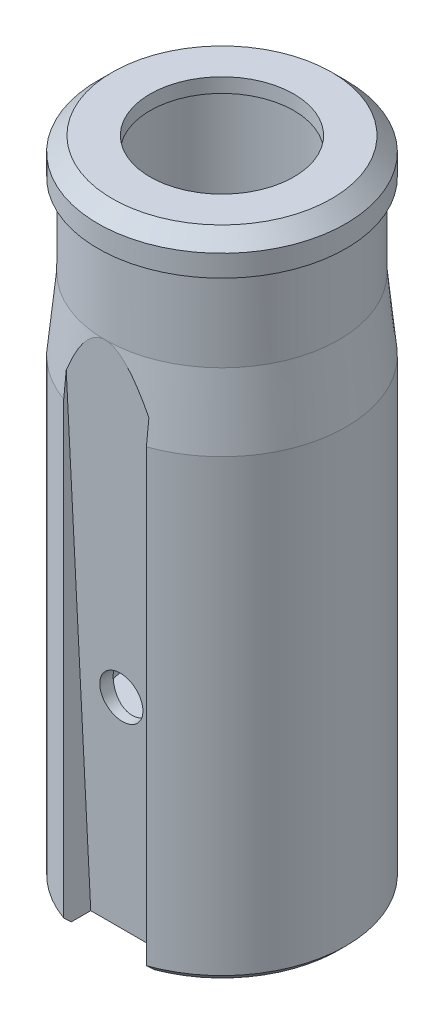
ISO-10303-21;
HEADER;
FILE_DESCRIPTION(('STEP AP214'),'2;1');
FILE_NAME('part.step','',(''),(''),'','','');
FILE_SCHEMA(('AUTOMOTIVE_DESIGN { 1 0 10303 214 1 1 1 1 }'));
ENDSEC;
DATA;
#1=APPLICATION_CONTEXT('core data for automotive mechanical design processes');
#2=APPLICATION_PROTOCOL_DEFINITION('international standard','automotive_design',2000,#1);
#3=PRODUCT_CONTEXT('',#1,'mechanical');
#4=PRODUCT('Part','Part','',(#3));
#5=PRODUCT_RELATED_PRODUCT_CATEGORY('part','',(#4));
#6=PRODUCT_DEFINITION_FORMATION('','',#4);
#7=PRODUCT_DEFINITION_CONTEXT('part definition',#1,'design');
#8=PRODUCT_DEFINITION('design','',#6,#7);
#9=PRODUCT_DEFINITION_SHAPE('','',#8);
#10=(LENGTH_UNIT() NAMED_UNIT(*) SI_UNIT(.MILLI.,.METRE.));
#11=(NAMED_UNIT(*) PLANE_ANGLE_UNIT() SI_UNIT($,.RADIAN.));
#12=(NAMED_UNIT(*) SI_UNIT($,.STERADIAN.) SOLID_ANGLE_UNIT());
#13=UNCERTAINTY_MEASURE_WITH_UNIT(LENGTH_MEASURE(1.E-05),#10,'distance_accuracy_value','');
#14=(GEOMETRIC_REPRESENTATION_CONTEXT(3) GLOBAL_UNCERTAINTY_ASSIGNED_CONTEXT((#13)) GLOBAL_UNIT_ASSIGNED_CONTEXT((#10,
#11,#12)) REPRESENTATION_CONTEXT('',''));
#15=CARTESIAN_POINT('',(0.,0.,0.));
#16=DIRECTION('',(0.,0.,1.));
#17=DIRECTION('',(1.,0.,0.));
#18=AXIS2_PLACEMENT_3D('',#15,#16,#17);
#19=CARTESIAN_POINT('',(1.1,0.,0.));
#20=DIRECTION('',(0.,-1.,0.));
#21=DIRECTION('',(0.,0.,-1.));
#22=AXIS2_PLACEMENT_3D('',#19,#20,#21);
#23=PLANE('',#22);
#24=CARTESIAN_POINT('',(0.,0.,0.));
#25=DIRECTION('',(0.,-1.,0.));
#26=DIRECTION('',(0.,0.,-1.));
#27=AXIS2_PLACEMENT_3D('',#24,#25,#26);
#28=CIRCLE('',#27,1.1);
#29=CARTESIAN_POINT('',(0.,0.,-1.1));
#30=VERTEX_POINT('',#29);
#31=EDGE_CURVE('E303',#30,#30,#28,.T.);
#32=ORIENTED_EDGE('',*,*,#31,.F.);
#33=EDGE_LOOP('',(#32));
#34=FACE_BOUND('',#33,.T.);
#35=CARTESIAN_POINT('',(0.,0.,0.));
#36=DIRECTION('',(0.,-1.,0.));
#37=DIRECTION('',(0.,0.,-1.));
#38=AXIS2_PLACEMENT_3D('',#35,#36,#37);
#39=CIRCLE('',#38,3.25);
#40=CARTESIAN_POINT('',(1.15,0.,-3.03973683071414));
#41=VERTEX_POINT('',#40);
#42=CARTESIAN_POINT('',(1.15,0.,3.03973683071414));
#43=VERTEX_POINT('',#42);
#44=EDGE_CURVE('E154',#41,#43,#39,.T.);
#45=ORIENTED_EDGE('',*,*,#44,.T.);
#46=DIRECTION('',(0.,0.,-1.));
#47=VECTOR('',#46,1.);
#48=CARTESIAN_POINT('',(1.15,0.,3.45));
#49=LINE('',#48,#47);
#50=CARTESIAN_POINT('',(1.15,0.,2.5));
#51=VERTEX_POINT('',#50);
#52=EDGE_CURVE('E138',#43,#51,#49,.T.);
#53=ORIENTED_EDGE('',*,*,#52,.T.);
#54=DIRECTION('',(-1.,0.,0.));
#55=VECTOR('',#54,1.);
#56=CARTESIAN_POINT('',(1.15,0.,2.5));
#57=LINE('',#56,#55);
#58=CARTESIAN_POINT('',(-1.15,0.,2.5));
#59=VERTEX_POINT('',#58);
#60=EDGE_CURVE('E145',#51,#59,#57,.T.);
#61=ORIENTED_EDGE('',*,*,#60,.T.);
#62=DIRECTION('',(0.,0.,1.));
#63=VECTOR('',#62,1.);
#64=CARTESIAN_POINT('',(-1.15,0.,3.45));
#65=LINE('',#64,#63);
#66=CARTESIAN_POINT('',(-1.15,0.,3.03973683071414));
#67=VERTEX_POINT('',#66);
#68=EDGE_CURVE('E149',#59,#67,#65,.T.);
#69=ORIENTED_EDGE('',*,*,#68,.T.);
#70=CARTESIAN_POINT('',(-1.15,0.,-3.03973683071414));
#71=VERTEX_POINT('',#70);
#72=EDGE_CURVE('E164',#67,#71,#39,.T.);
#73=ORIENTED_EDGE('',*,*,#72,.T.);
#74=DIRECTION('',(0.,0.,-1.));
#75=VECTOR('',#74,1.);
#76=CARTESIAN_POINT('',(-1.15,0.,-3.45));
#77=LINE('',#76,#75);
#78=CARTESIAN_POINT('',(-1.15,0.,-2.5));
#79=VERTEX_POINT('',#78);
#80=EDGE_CURVE('E178',#79,#71,#77,.T.);
#81=ORIENTED_EDGE('',*,*,#80,.F.);
#82=DIRECTION('',(-1.,0.,0.));
#83=VECTOR('',#82,1.);
#84=CARTESIAN_POINT('',(1.15,0.,-2.5));
#85=LINE('',#84,#83);
#86=CARTESIAN_POINT('',(1.15,0.,-2.5));
#87=VERTEX_POINT('',#86);
#88=EDGE_CURVE('E182',#87,#79,#85,.T.);
#89=ORIENTED_EDGE('',*,*,#88,.F.);
#90=DIRECTION('',(0.,0.,1.));
#91=VECTOR('',#90,1.);
#92=CARTESIAN_POINT('',(1.15,0.,-3.45));
#93=LINE('',#92,#91);
#94=EDGE_CURVE('E188',#41,#87,#93,.T.);
#95=ORIENTED_EDGE('',*,*,#94,.F.);
#96=EDGE_LOOP('',(#45,#53,#61,#69,#73,#81,#89,#95));
#97=FACE_BOUND('',#96,.T.);
#98=ADVANCED_FACE('F49',(#34,#97),#23,.T.);
#99=CARTESIAN_POINT('',(0.,0.,0.));
#100=DIRECTION('',(0.,1.,0.));
#101=DIRECTION('',(0.,0.,1.));
#102=AXIS2_PLACEMENT_3D('',#99,#100,#101);
#103=CONICAL_SURFACE('',#102,3.25,0.785398163397447);
#104=CARTESIAN_POINT('',(0.,0.2,0.));
#105=DIRECTION('',(0.,-1.,0.));
#106=DIRECTION('',(0.,0.,-1.));
#107=AXIS2_PLACEMENT_3D('',#104,#105,#106);
#108=CIRCLE('',#107,3.45);
#109=CARTESIAN_POINT('',(1.15,0.2,-3.25269119345812));
#110=VERTEX_POINT('',#109);
#111=CARTESIAN_POINT('',(1.15,0.2,3.25269119345812));
#112=VERTEX_POINT('',#111);
#113=EDGE_CURVE('E166',#110,#112,#108,.T.);
#114=ORIENTED_EDGE('',*,*,#113,.T.);
#115=CARTESIAN_POINT('',(1.15,0.200225,3.25292984102409));
#116=CARTESIAN_POINT('',(1.15,0.166733085444312,3.21741097282165));
#117=CARTESIAN_POINT('',(1.15,0.133276711997652,3.18185872559596));
#118=CARTESIAN_POINT('',(1.15,0.0664350453267408,3.11068747097317));
#119=CARTESIAN_POINT('',(1.15,0.0330497521067336,3.07506846357209));
#120=CARTESIAN_POINT('',(1.15,-0.000300000000000371,3.03941607714377));
#121=B_SPLINE_CURVE_WITH_KNOTS('',3,(#115,#116,#117,#118,#119,#120),.UNSPECIFIED.,.F.,.F.,(4,2,
4),(0.,0.146456890800636,0.292913790346612),.UNSPECIFIED.);
#122=EDGE_CURVE('E364',#112,#43,#121,.T.);
#123=ORIENTED_EDGE('',*,*,#122,.T.);
#124=ORIENTED_EDGE('',*,*,#44,.F.);
#125=CARTESIAN_POINT('',(1.15,-0.000199999999999813,-3.03952299547149));
#126=CARTESIAN_POINT('',(1.15,0.0331290101696303,-3.0751530570593));
#127=CARTESIAN_POINT('',(1.15,0.0664935157531291,-3.11074978248644));
#128=CARTESIAN_POINT('',(1.15,0.13329351575736,-3.18187655889995));
#129=CARTESIAN_POINT('',(1.15,0.166729010173861,-3.21740660989029));
#130=CARTESIAN_POINT('',(1.15,0.2002,-3.25290332472393));
#131=B_SPLINE_CURVE_WITH_KNOTS('',3,(#125,#126,#127,#128,#129,#130),.UNSPECIFIED.,.F.,.F.,(4,2,
4),(0.,0.146365480376002,0.292730952029218),.UNSPECIFIED.);
#132=EDGE_CURVE('E305',#41,#110,#131,.T.);
#133=ORIENTED_EDGE('',*,*,#132,.T.);
#134=EDGE_LOOP('',(#114,#123,#124,#133));
#135=FACE_BOUND('',#134,.T.);
#136=ADVANCED_FACE('F249',(#135),#103,.T.);
#137=ORIENTED_EDGE('',*,*,#72,.F.);
#138=CARTESIAN_POINT('',(-1.15,-0.000300000000000207,3.03941607714377));
#139=CARTESIAN_POINT('',(-1.15,0.0330497521067339,3.07506846357209));
#140=CARTESIAN_POINT('',(-1.15,0.066435045326741,3.11068747097317));
#141=CARTESIAN_POINT('',(-1.15,0.133276711997652,3.18185872559596));
#142=CARTESIAN_POINT('',(-1.15,0.166733085444312,3.21741097282165));
#143=CARTESIAN_POINT('',(-1.15,0.200225,3.25292984102409));
#144=B_SPLINE_CURVE_WITH_KNOTS('',3,(#138,#139,#140,#141,#142,#143),.UNSPECIFIED.,.F.,.F.,(4,2,
4),(0.,0.146456899545976,0.292913790346612),.UNSPECIFIED.);
#145=CARTESIAN_POINT('',(-1.15,0.2,3.25269119345812));
#146=VERTEX_POINT('',#145);
#147=EDGE_CURVE('E274',#67,#146,#144,.T.);
#148=ORIENTED_EDGE('',*,*,#147,.T.);
#149=CARTESIAN_POINT('',(-1.15,0.2,-3.25269119345812));
#150=VERTEX_POINT('',#149);
#151=EDGE_CURVE('E335',#146,#150,#108,.T.);
#152=ORIENTED_EDGE('',*,*,#151,.T.);
#153=CARTESIAN_POINT('',(-1.15,0.2002,-3.25290332472393));
#154=CARTESIAN_POINT('',(-1.15,0.166729010173861,-3.21740660989029));
#155=CARTESIAN_POINT('',(-1.15,0.13329351575736,-3.18187655889995));
#156=CARTESIAN_POINT('',(-1.15,0.0664935157531292,-3.11074978248644));
#157=CARTESIAN_POINT('',(-1.15,0.0331290101696304,-3.0751530570593));
#158=CARTESIAN_POINT('',(-1.15,-0.000199999999999843,-3.03952299547149));
#159=B_SPLINE_CURVE_WITH_KNOTS('',3,(#153,#154,#155,#156,#157,#158),.UNSPECIFIED.,.F.,.F.,(4,2,
4),(0.,0.146365471653215,0.292730952029218),.UNSPECIFIED.);
#160=EDGE_CURVE('E245',#150,#71,#159,.T.);
#161=ORIENTED_EDGE('',*,*,#160,.T.);
#162=EDGE_LOOP('',(#137,#148,#152,#161));
#163=FACE_BOUND('',#162,.T.);
#164=ADVANCED_FACE('F252',(#163),#103,.T.);
#165=CARTESIAN_POINT('',(0.,0.,0.));
#166=DIRECTION('',(0.,-1.,0.));
#167=DIRECTION('',(0.,0.,-1.));
#168=AXIS2_PLACEMENT_3D('',#165,#166,#167);
#169=CYLINDRICAL_SURFACE('',#168,3.45);
#170=CARTESIAN_POINT('',(0.,12.7,0.));
#171=DIRECTION('',(0.,-1.,0.));
#172=DIRECTION('',(0.,0.,-1.));
#173=AXIS2_PLACEMENT_3D('',#170,#171,#172);
#174=CIRCLE('',#173,3.45);
#175=CARTESIAN_POINT('',(1.15,12.7,-3.25269119345812));
#176=VERTEX_POINT('',#175);
#177=CARTESIAN_POINT('',(1.15,12.7,3.25269119345812));
#178=VERTEX_POINT('',#177);
#179=EDGE_CURVE('E333',#176,#178,#174,.T.);
#180=ORIENTED_EDGE('',*,*,#179,.T.);
#181=DIRECTION('',(0.,-1.,0.));
#182=VECTOR('',#181,1.);
#183=CARTESIAN_POINT('',(1.15,0.,3.25269119345812));
#184=LINE('',#183,#182);
#185=EDGE_CURVE('E276',#178,#112,#184,.T.);
#186=ORIENTED_EDGE('',*,*,#185,.T.);
#187=ORIENTED_EDGE('',*,*,#113,.F.);
#188=DIRECTION('',(0.,-1.,0.));
#189=VECTOR('',#188,1.);
#190=CARTESIAN_POINT('',(1.15,0.,-3.25269119345812));
#191=LINE('',#190,#189);
#192=EDGE_CURVE('E247',#110,#176,#191,.F.);
#193=ORIENTED_EDGE('',*,*,#192,.T.);
#194=EDGE_LOOP('',(#180,#186,#187,#193));
#195=FACE_BOUND('',#194,.T.);
#196=ADVANCED_FACE('F254',(#195),#169,.T.);
#197=ORIENTED_EDGE('',*,*,#151,.F.);
#198=DIRECTION('',(0.,-1.,0.));
#199=VECTOR('',#198,1.);
#200=CARTESIAN_POINT('',(-1.15,0.,3.25269119345812));
#201=LINE('',#200,#199);
#202=CARTESIAN_POINT('',(-1.15,12.7,3.25269119345812));
#203=VERTEX_POINT('',#202);
#204=EDGE_CURVE('E402',#146,#203,#201,.F.);
#205=ORIENTED_EDGE('',*,*,#204,.T.);
#206=CARTESIAN_POINT('',(-1.15,12.7,-3.25269119345812));
#207=VERTEX_POINT('',#206);
#208=EDGE_CURVE('E73',#203,#207,#174,.T.);
#209=ORIENTED_EDGE('',*,*,#208,.T.);
#210=DIRECTION('',(0.,-1.,0.));
#211=VECTOR('',#210,1.);
#212=CARTESIAN_POINT('',(-1.15,0.,-3.25269119345812));
#213=LINE('',#212,#211);
#214=EDGE_CURVE('E344',#207,#150,#213,.T.);
#215=ORIENTED_EDGE('',*,*,#214,.T.);
#216=EDGE_LOOP('',(#197,#205,#209,#215));
#217=FACE_BOUND('',#216,.T.);
#218=ADVANCED_FACE('F346',(#217),#169,.T.);
#219=CARTESIAN_POINT('',(0.,12.7,0.));
#220=DIRECTION('',(0.,-1.,0.));
#221=DIRECTION('',(0.,0.,-1.));
#222=AXIS2_PLACEMENT_3D('',#219,#220,#221);
#223=CONICAL_SURFACE('',#222,3.45,0.0996686524911623);
#224=CARTESIAN_POINT('',(-1.1503,13.3654718233185,3.18191182772033));
#225=CARTESIAN_POINT('',(-1.12461776207383,13.4244312078679,3.1849199595851));
#226=CARTESIAN_POINT('',(-1.09826771112041,13.483112214366,3.18791388848806));
#227=CARTESIAN_POINT('',(-1.04388608200021,13.5997742171383,3.19386603148665));
#228=CARTESIAN_POINT('',(-1.0158525556377,13.6577543053391,3.196824199252));
#229=CARTESIAN_POINT('',(-0.957302725419975,13.7737503130482,3.20274236291062));
#230=CARTESIAN_POINT('',(-0.926751213711643,13.8317486407838,3.20570146126448));
#231=CARTESIAN_POINT('',(-0.863141815796635,13.946331722473,3.21154753686087));
#232=CARTESIAN_POINT('',(-0.830085193368113,14.0029171702917,3.21443454950468));
#233=CARTESIAN_POINT('',(-0.750985790895408,14.1299040694137,3.22091347292927));
#234=CARTESIAN_POINT('',(-0.703917992910907,14.1996753382354,3.22447323154262));
#235=CARTESIAN_POINT('',(-0.602652406644307,14.3336205827774,3.23130717259069));
#236=CARTESIAN_POINT('',(-0.548491094481236,14.3978205745098,3.23458268237295));
#237=CARTESIAN_POINT('',(-0.459503793261035,14.4861177159726,3.23908763857003));
#238=CARTESIAN_POINT('',(-0.428640749248743,14.514153644171,3.24051804306995));
#239=CARTESIAN_POINT('',(-0.363757978070815,14.5664086531007,3.24318411495412));
#240=CARTESIAN_POINT('',(-0.329739417181506,14.5906291351573,3.24441985383456));
#241=CARTESIAN_POINT('',(-0.265134099259169,14.6292698680766,3.24639131979983));
#242=CARTESIAN_POINT('',(-0.235150985352465,14.6446793197424,3.24717751631339));
#243=CARTESIAN_POINT('',(-0.173083492039088,14.6704609839957,3.24849290734672));
#244=CARTESIAN_POINT('',(-0.141003608623126,14.680843597631,3.24902263253219));
#245=CARTESIAN_POINT('',(-0.0807162042676482,14.6941332653954,3.24970067680589));
#246=CARTESIAN_POINT('',(-0.052718495531027,14.6979758553342,3.24989672731297));
#247=CARTESIAN_POINT('',(0.0035236891045383,14.700791444853,3.25004037983944));
#248=CARTESIAN_POINT('',(0.0317680901785457,14.6997658730862,3.2499880547493));
#249=CARTESIAN_POINT('',(0.0875865550885317,14.6929782840638,3.24964174918693));
#250=CARTESIAN_POINT('',(0.11516220100868,14.6872288623726,3.24934841134554));
#251=CARTESIAN_POINT('',(0.169106575516835,14.6716171449104,3.24855189514849));
#252=CARTESIAN_POINT('',(0.195474379305243,14.6617517542375,3.24804855888967));
#253=CARTESIAN_POINT('',(0.261673556721591,14.6319583727569,3.24652848840596));
#254=CARTESIAN_POINT('',(0.300361431149439,14.6095196012343,3.2453836531242));
#255=CARTESIAN_POINT('',(0.373930877280613,14.5590934188922,3.24281088871899));
#256=CARTESIAN_POINT('',(0.408798702652541,14.5310869283841,3.24138198614204));
#257=CARTESIAN_POINT('',(0.483089381205102,14.4643872116369,3.23797893936923));
#258=CARTESIAN_POINT('',(0.521634520504094,14.4247340587249,3.2359558193227));
#259=CARTESIAN_POINT('',(0.594787864067085,14.3419170826898,3.23173046340254));
#260=CARTESIAN_POINT('',(0.62938835530849,14.2987466553803,3.22952789058063));
#261=CARTESIAN_POINT('',(0.729006417621503,14.1652605902371,3.22271737705292));
#262=CARTESIAN_POINT('',(0.789331248378986,14.0714862877101,3.21793297386276));
#263=CARTESIAN_POINT('',(0.903832169886198,13.8762385893024,3.20797135659706));
#264=CARTESIAN_POINT('',(0.957734339558885,13.774612478882,3.20278635096337));
#265=CARTESIAN_POINT('',(1.03357052249165,13.6211199238028,3.1949550981532));
#266=CARTESIAN_POINT('',(1.05776894594106,13.5703544111632,3.19236502097771));
#267=CARTESIAN_POINT('',(1.10491737230164,13.468290305846,3.18715766866561));
#268=CARTESIAN_POINT('',(1.12786823309838,13.4169921091352,3.18454041373139));
#269=CARTESIAN_POINT('',(1.1503,13.3654718233185,3.18191182772033));
#270=B_SPLINE_CURVE_WITH_KNOTS('',3,(#224,#225,#226,#227,#228,#229,#230,#231,#232,#233,#234,
#235,#236,#237,#238,#239,#240,#241,#242,#243,#244,#245,#246,#247,#248,#249,#250,#251,#252,#253,
#254,#255,#256,#257,#258,#259,#260,#261,#262,#263,#264,#265,#266,#267,#268,#269),.UNSPECIFIED.,
.F.,.F.,(4,2,2,2,2,2,2,2,2,2,2,2,2,2,2,2,2,2,2,2,2,2,4),(0.,0.193153196094432,0.386534394479574,
0.583344323152792,0.780055617774618,1.03252508395624,1.28374384951399,1.40870460852014,
1.53361936477854,1.63444072616798,1.73505257662853,1.819439156786,1.90380097365375,
1.98793857733241,2.07213956056535,2.20557857570592,2.33948300207813,2.5051089558914,
2.67105339865646,3.00509659575753,3.35033806491734,3.51921597717028,3.68797625210565),.UNSPECIFIED.);
#271=CARTESIAN_POINT('',(0.,14.7,3.25));
#272=VERTEX_POINT('',#271);
#273=CARTESIAN_POINT('',(1.15,13.3661609689702,3.18194698821277));
#274=VERTEX_POINT('',#273);
#275=EDGE_CURVE('E155',#272,#274,#270,.T.);
#276=ORIENTED_EDGE('',*,*,#275,.T.);
#277=CARTESIAN_POINT('',(1.15,14.7003,3.03970475554781));
#278=CARTESIAN_POINT('',(1.15,14.3668982579547,3.07534620219941));
#279=CARTESIAN_POINT('',(1.15,14.0334890533787,3.11091756314071));
#280=CARTESIAN_POINT('',(1.15,13.3666557200453,3.18192011350903));
#281=CARTESIAN_POINT('',(1.15,13.033231591288,3.21735130293641));
#282=CARTESIAN_POINT('',(1.15,12.6998,3.25271240665387));
#283=B_SPLINE_CURVE_WITH_KNOTS('',3,(#277,#278,#279,#280,#281,#282),.UNSPECIFIED.,.F.,.F.,(4,2,
4),(0.,1.00590415782854,2.0118083130027),.UNSPECIFIED.);
#284=EDGE_CURVE('E12',#274,#178,#283,.T.);
#285=ORIENTED_EDGE('',*,*,#284,.T.);
#286=ORIENTED_EDGE('',*,*,#179,.F.);
#287=CARTESIAN_POINT('',(1.15,12.6998,-3.25271240665387));
#288=CARTESIAN_POINT('',(1.15,13.0332149230487,-3.21735307014957));
#289=CARTESIAN_POINT('',(1.15,13.3666223843531,-3.18192365530599));
#290=CARTESIAN_POINT('',(1.15,14.0334223843532,-3.11092466884661));
#291=CARTESIAN_POINT('',(1.15,14.3668149230487,-3.07535509723044));
#292=CARTESIAN_POINT('',(1.15,14.7002,-3.03971544727463));
#293=B_SPLINE_CURVE_WITH_KNOTS('',3,(#287,#288,#289,#290,#291,#292),.UNSPECIFIED.,.F.,.F.,(4,2,
4),(0.,1.00585387020517,2.01170774306415),.UNSPECIFIED.);
#294=CARTESIAN_POINT('',(1.15,13.3661609689609,-3.18194698821229));
#295=VERTEX_POINT('',#294);
#296=EDGE_CURVE('E216',#176,#295,#293,.T.);
#297=ORIENTED_EDGE('',*,*,#296,.T.);
#298=CARTESIAN_POINT('',(1.1503,13.3654718233185,-3.18191182772033));
#299=CARTESIAN_POINT('',(1.12461776207383,13.4244312078679,-3.1849199595851));
#300=CARTESIAN_POINT('',(1.09826771112042,13.483112214366,-3.18791388848806));
#301=CARTESIAN_POINT('',(1.04388608200021,13.5997742171383,-3.19386603148665));
#302=CARTESIAN_POINT('',(1.0158525556377,13.6577543053391,-3.196824199252));
#303=CARTESIAN_POINT('',(0.957302725419974,13.7737503130482,-3.20274236291062));
#304=CARTESIAN_POINT('',(0.926751213711643,13.8317486407838,-3.20570146126448));
#305=CARTESIAN_POINT('',(0.863141815796635,13.946331722473,-3.21154753686087));
#306=CARTESIAN_POINT('',(0.830085193368112,14.0029171702917,-3.21443454950468));
#307=CARTESIAN_POINT('',(0.750985790895407,14.1299040694137,-3.22091347292927));
#308=CARTESIAN_POINT('',(0.703917992910907,14.1996753382354,-3.22447323154262));
#309=CARTESIAN_POINT('',(0.60265240664431,14.3336205827774,-3.23130717259069));
#310=CARTESIAN_POINT('',(0.54849109448124,14.3978205745098,-3.23458268237295));
#311=CARTESIAN_POINT('',(0.459503793261039,14.4861177159726,-3.23908763857003));
#312=CARTESIAN_POINT('',(0.428640749248747,14.514153644171,-3.24051804306995));
#313=CARTESIAN_POINT('',(0.363757978070818,14.5664086531007,-3.24318411495412));
#314=CARTESIAN_POINT('',(0.329739417181508,14.5906291351573,-3.24441985383456));
#315=CARTESIAN_POINT('',(0.265134099259171,14.6292698680766,-3.24639131979983));
#316=CARTESIAN_POINT('',(0.235150985352467,14.6446793197424,-3.24717751631339));
#317=CARTESIAN_POINT('',(0.17308349203909,14.6704609839957,-3.24849290734672));
#318=CARTESIAN_POINT('',(0.141003608623129,14.680843597631,-3.24902263253219));
#319=CARTESIAN_POINT('',(0.0807162042676523,14.6941332653954,-3.24970067680589));
#320=CARTESIAN_POINT('',(0.0527184955310311,14.6979758553342,-3.24989672731297));
#321=CARTESIAN_POINT('',(-0.00352368910453429,14.700791444853,-3.25004037983944));
#322=CARTESIAN_POINT('',(-0.0317680901785417,14.6997658730862,-3.2499880547493));
#323=CARTESIAN_POINT('',(-0.0875865550885274,14.6929782840638,-3.24964174918693));
#324=CARTESIAN_POINT('',(-0.115162201008675,14.6872288623726,-3.24934841134554));
#325=CARTESIAN_POINT('',(-0.16910657551683,14.6716171449104,-3.24855189514849));
#326=CARTESIAN_POINT('',(-0.195474379305239,14.6617517542375,-3.24804855888967));
#327=CARTESIAN_POINT('',(-0.261673556721586,14.6319583727569,-3.24652848840596));
#328=CARTESIAN_POINT('',(-0.300361431149434,14.6095196012343,-3.2453836531242));
#329=CARTESIAN_POINT('',(-0.373930877280608,14.5590934188922,-3.24281088871899));
#330=CARTESIAN_POINT('',(-0.408798702652536,14.5310869283841,-3.24138198614204));
#331=CARTESIAN_POINT('',(-0.483089381205096,14.4643872116369,-3.23797893936923));
#332=CARTESIAN_POINT('',(-0.521634520504086,14.4247340587249,-3.2359558193227));
#333=CARTESIAN_POINT('',(-0.594787864067075,14.3419170826898,-3.23173046340254));
#334=CARTESIAN_POINT('',(-0.62938835530848,14.2987466553803,-3.22952789058063));
#335=CARTESIAN_POINT('',(-0.729006417621492,14.1652605902372,-3.22271737705292));
#336=CARTESIAN_POINT('',(-0.789331248378976,14.0714862877102,-3.21793297386276));
#337=CARTESIAN_POINT('',(-0.903832169886191,13.8762385893024,-3.20797135659706));
#338=CARTESIAN_POINT('',(-0.957734339558879,13.774612478882,-3.20278635096337));
#339=CARTESIAN_POINT('',(-1.03357052249164,13.6211199238028,-3.1949550981532));
#340=CARTESIAN_POINT('',(-1.05776894594106,13.5703544111632,-3.19236502097771));
#341=CARTESIAN_POINT('',(-1.10491737230164,13.468290305846,-3.18715766866561));
#342=CARTESIAN_POINT('',(-1.12786823309838,13.4169921091352,-3.18454041373139));
#343=CARTESIAN_POINT('',(-1.1503,13.3654718233185,-3.18191182772033));
#344=B_SPLINE_CURVE_WITH_KNOTS('',3,(#298,#299,#300,#301,#302,#303,#304,#305,#306,#307,#308,
#309,#310,#311,#312,#313,#314,#315,#316,#317,#318,#319,#320,#321,#322,#323,#324,#325,#326,#327,
#328,#329,#330,#331,#332,#333,#334,#335,#336,#337,#338,#339,#340,#341,#342,#343),.UNSPECIFIED.,
.F.,.F.,(4,2,2,2,2,2,2,2,2,2,2,2,2,2,2,2,2,2,2,2,2,2,4),(0.,0.193153196094433,0.386534394479578,
0.583344323152797,0.780055617774624,1.03252508395624,1.28374384951399,1.40870460852014,
1.53361936477854,1.63444072616798,1.73505257662852,1.819439156786,1.90380097365375,
1.98793857733241,2.07213956056535,2.20557857570591,2.33948300207812,2.50510895589139,
2.67105339865645,3.00509659575751,3.35033806491733,3.51921597717028,3.68797625210565),.UNSPECIFIED.);
#345=CARTESIAN_POINT('',(0.,14.7,-3.25));
#346=VERTEX_POINT('',#345);
#347=EDGE_CURVE('E347',#295,#346,#344,.T.);
#348=ORIENTED_EDGE('',*,*,#347,.T.);
#349=CARTESIAN_POINT('',(0.,14.7,0.));
#350=DIRECTION('',(0.,-1.,0.));
#351=DIRECTION('',(0.,0.,-1.));
#352=AXIS2_PLACEMENT_3D('',#349,#350,#351);
#353=CIRCLE('',#352,3.25);
#354=EDGE_CURVE('E197',#346,#272,#353,.T.);
#355=ORIENTED_EDGE('',*,*,#354,.T.);
#356=EDGE_LOOP('',(#276,#285,#286,#297,#348,#355));
#357=FACE_BOUND('',#356,.T.);
#358=ADVANCED_FACE('F222',(#357),#223,.T.);
#359=CARTESIAN_POINT('',(-1.15,12.6998,3.25271240665387));
#360=CARTESIAN_POINT('',(-1.15,13.033231591288,3.21735130293641));
#361=CARTESIAN_POINT('',(-1.15,13.3666557200453,3.18192011350903));
#362=CARTESIAN_POINT('',(-1.15,14.0334890533787,3.11091756314071));
#363=CARTESIAN_POINT('',(-1.15,14.3668982579547,3.07534620219941));
#364=CARTESIAN_POINT('',(-1.15,14.7003,3.03970475554781));
#365=B_SPLINE_CURVE_WITH_KNOTS('',3,(#359,#360,#361,#362,#363,#364),.UNSPECIFIED.,.F.,.F.,(4,2,
4),(0.,1.00590415517416,2.0118083130027),.UNSPECIFIED.);
#366=CARTESIAN_POINT('',(-1.15,13.3661609689503,3.18194698821175));
#367=VERTEX_POINT('',#366);
#368=EDGE_CURVE('E57',#203,#367,#365,.T.);
#369=ORIENTED_EDGE('',*,*,#368,.T.);
#370=EDGE_CURVE('E156',#367,#272,#270,.T.);
#371=ORIENTED_EDGE('',*,*,#370,.T.);
#372=EDGE_CURVE('E195',#272,#346,#353,.T.);
#373=ORIENTED_EDGE('',*,*,#372,.T.);
#374=CARTESIAN_POINT('',(-1.15,13.3661609689503,-3.18194698821175));
#375=VERTEX_POINT('',#374);
#376=EDGE_CURVE('E192',#346,#375,#344,.T.);
#377=ORIENTED_EDGE('',*,*,#376,.T.);
#378=CARTESIAN_POINT('',(-1.15,14.7002,-3.03971544727463));
#379=CARTESIAN_POINT('',(-1.15,14.3668149230487,-3.07535509723044));
#380=CARTESIAN_POINT('',(-1.15,14.0334223843532,-3.11092466884661));
#381=CARTESIAN_POINT('',(-1.15,13.3666223843531,-3.18192365530599));
#382=CARTESIAN_POINT('',(-1.15,13.0332149230487,-3.21735307014957));
#383=CARTESIAN_POINT('',(-1.15,12.6998,-3.25271240665387));
#384=B_SPLINE_CURVE_WITH_KNOTS('',3,(#378,#379,#380,#381,#382,#383),.UNSPECIFIED.,.F.,.F.,(4,2,
4),(0.,1.00585387285898,2.01170774306415),.UNSPECIFIED.);
#385=EDGE_CURVE('E208',#375,#207,#384,.T.);
#386=ORIENTED_EDGE('',*,*,#385,.T.);
#387=ORIENTED_EDGE('',*,*,#208,.F.);
#388=EDGE_LOOP('',(#369,#371,#373,#377,#386,#387));
#389=FACE_BOUND('',#388,.T.);
#390=ADVANCED_FACE('F413',(#389),#223,.T.);
#391=CARTESIAN_POINT('',(0.,0.,0.));
#392=DIRECTION('',(0.,-1.,0.));
#393=DIRECTION('',(0.,0.,-1.));
#394=AXIS2_PLACEMENT_3D('',#391,#392,#393);
#395=CYLINDRICAL_SURFACE('',#394,3.25);
#396=CARTESIAN_POINT('',(0.,17.,0.));
#397=DIRECTION('',(0.,-1.,0.));
#398=DIRECTION('',(0.,0.,-1.));
#399=AXIS2_PLACEMENT_3D('',#396,#397,#398);
#400=CIRCLE('',#399,3.25);
#401=CARTESIAN_POINT('',(0.,17.,-3.25));
#402=VERTEX_POINT('',#401);
#403=EDGE_CURVE('E198',#402,#402,#400,.T.);
#404=ORIENTED_EDGE('',*,*,#403,.T.);
#405=EDGE_LOOP('',(#404));
#406=FACE_BOUND('',#405,.T.);
#407=ORIENTED_EDGE('',*,*,#354,.F.);
#408=ORIENTED_EDGE('',*,*,#372,.F.);
#409=EDGE_LOOP('',(#407,#408));
#410=FACE_BOUND('',#409,.T.);
#411=ADVANCED_FACE('F420',(#406,#410),#395,.T.);
#412=CARTESIAN_POINT('',(3.25,17.,0.));
#413=DIRECTION('',(0.,-1.,0.));
#414=DIRECTION('',(0.,0.,-1.));
#415=AXIS2_PLACEMENT_3D('',#412,#413,#414);
#416=PLANE('',#415);
#417=CARTESIAN_POINT('',(0.,17.,0.));
#418=DIRECTION('',(0.,-1.,0.));
#419=DIRECTION('',(0.,0.,-1.));
#420=AXIS2_PLACEMENT_3D('',#417,#418,#419);
#421=CIRCLE('',#420,3.45);
#422=CARTESIAN_POINT('',(0.,17.,-3.45));
#423=VERTEX_POINT('',#422);
#424=EDGE_CURVE('E328',#423,#423,#421,.T.);
#425=ORIENTED_EDGE('',*,*,#424,.T.);
#426=EDGE_LOOP('',(#425));
#427=FACE_BOUND('',#426,.T.);
#428=ORIENTED_EDGE('',*,*,#403,.F.);
#429=EDGE_LOOP('',(#428));
#430=FACE_BOUND('',#429,.T.);
#431=ADVANCED_FACE('F422',(#427,#430),#416,.T.);
#432=CARTESIAN_POINT('',(0.,0.,0.));
#433=DIRECTION('',(0.,-1.,0.));
#434=DIRECTION('',(0.,0.,-1.));
#435=AXIS2_PLACEMENT_3D('',#432,#433,#434);
#436=CYLINDRICAL_SURFACE('',#435,3.45);
#437=CARTESIAN_POINT('',(0.,17.6,0.));
#438=DIRECTION('',(0.,-1.,0.));
#439=DIRECTION('',(0.,0.,-1.));
#440=AXIS2_PLACEMENT_3D('',#437,#438,#439);
#441=CIRCLE('',#440,3.45);
#442=CARTESIAN_POINT('',(0.,17.6,-3.45));
#443=VERTEX_POINT('',#442);
#444=EDGE_CURVE('E325',#443,#443,#441,.T.);
#445=ORIENTED_EDGE('',*,*,#444,.T.);
#446=EDGE_LOOP('',(#445));
#447=FACE_BOUND('',#446,.T.);
#448=ORIENTED_EDGE('',*,*,#424,.F.);
#449=EDGE_LOOP('',(#448));
#450=FACE_BOUND('',#449,.T.);
#451=ADVANCED_FACE('F428',(#447,#450),#436,.T.);
#452=CARTESIAN_POINT('',(0.,17.6,0.));
#453=DIRECTION('',(0.,-1.,0.));
#454=DIRECTION('',(0.,0.,-1.));
#455=AXIS2_PLACEMENT_3D('',#452,#453,#454);
#456=CONICAL_SURFACE('',#455,3.45,0.785398163397447);
#457=CARTESIAN_POINT('',(0.,18.,0.));
#458=DIRECTION('',(0.,-1.,0.));
#459=DIRECTION('',(0.,0.,-1.));
#460=AXIS2_PLACEMENT_3D('',#457,#458,#459);
#461=CIRCLE('',#460,3.05);
#462=CARTESIAN_POINT('',(0.,18.,-3.05));
#463=VERTEX_POINT('',#462);
#464=EDGE_CURVE('E322',#463,#463,#461,.T.);
#465=ORIENTED_EDGE('',*,*,#464,.T.);
#466=EDGE_LOOP('',(#465));
#467=FACE_BOUND('',#466,.T.);
#468=ORIENTED_EDGE('',*,*,#444,.F.);
#469=EDGE_LOOP('',(#468));
#470=FACE_BOUND('',#469,.T.);
#471=ADVANCED_FACE('F434',(#467,#470),#456,.T.);
#472=CARTESIAN_POINT('',(3.05,18.,0.));
#473=DIRECTION('',(0.,1.,0.));
#474=DIRECTION('',(0.,0.,1.));
#475=AXIS2_PLACEMENT_3D('',#472,#473,#474);
#476=PLANE('',#475);
#477=CARTESIAN_POINT('',(0.,18.,0.));
#478=DIRECTION('',(0.,-1.,0.));
#479=DIRECTION('',(0.,0.,-1.));
#480=AXIS2_PLACEMENT_3D('',#477,#478,#479);
#481=CIRCLE('',#480,2.00000000000001);
#482=CARTESIAN_POINT('',(0.,18.,-2.00000000000001));
#483=VERTEX_POINT('',#482);
#484=EDGE_CURVE('E319',#483,#483,#481,.T.);
#485=ORIENTED_EDGE('',*,*,#484,.T.);
#486=EDGE_LOOP('',(#485));
#487=FACE_BOUND('',#486,.T.);
#488=ORIENTED_EDGE('',*,*,#464,.F.);
#489=EDGE_LOOP('',(#488));
#490=FACE_BOUND('',#489,.T.);
#491=ADVANCED_FACE('F438',(#487,#490),#476,.T.);
#492=CARTESIAN_POINT('',(0.,0.,0.));
#493=DIRECTION('',(0.,-1.,0.));
#494=DIRECTION('',(0.,0.,-1.));
#495=AXIS2_PLACEMENT_3D('',#492,#493,#494);
#496=CYLINDRICAL_SURFACE('',#495,2.00000000000001);
#497=CARTESIAN_POINT('',(0.,17.6,0.));
#498=DIRECTION('',(0.,-1.,0.));
#499=DIRECTION('',(0.,0.,-1.));
#500=AXIS2_PLACEMENT_3D('',#497,#498,#499);
#501=CIRCLE('',#500,2.00000000000001);
#502=CARTESIAN_POINT('',(0.,17.6,-2.00000000000001));
#503=VERTEX_POINT('',#502);
#504=EDGE_CURVE('E316',#503,#503,#501,.T.);
#505=ORIENTED_EDGE('',*,*,#504,.T.);
#506=EDGE_LOOP('',(#505));
#507=FACE_BOUND('',#506,.T.);
#508=ORIENTED_EDGE('',*,*,#484,.F.);
#509=EDGE_LOOP('',(#508));
#510=FACE_BOUND('',#509,.T.);
#511=ADVANCED_FACE('F442',(#507,#510),#496,.F.);
#512=CARTESIAN_POINT('',(2.00000000000001,17.6,0.));
#513=DIRECTION('',(0.,-1.,0.));
#514=DIRECTION('',(0.,0.,-1.));
#515=AXIS2_PLACEMENT_3D('',#512,#513,#514);
#516=PLANE('',#515);
#517=CARTESIAN_POINT('',(0.,17.6,0.));
#518=DIRECTION('',(0.,-1.,0.));
#519=DIRECTION('',(0.,0.,-1.));
#520=AXIS2_PLACEMENT_3D('',#517,#518,#519);
#521=CIRCLE('',#520,2.50000000000001);
#522=CARTESIAN_POINT('',(0.,17.6,-2.50000000000001));
#523=VERTEX_POINT('',#522);
#524=EDGE_CURVE('E313',#523,#523,#521,.T.);
#525=ORIENTED_EDGE('',*,*,#524,.T.);
#526=EDGE_LOOP('',(#525));
#527=FACE_BOUND('',#526,.T.);
#528=ORIENTED_EDGE('',*,*,#504,.F.);
#529=EDGE_LOOP('',(#528));
#530=FACE_BOUND('',#529,.T.);
#531=ADVANCED_FACE('F446',(#527,#530),#516,.T.);
#532=CARTESIAN_POINT('',(0.,0.,0.));
#533=DIRECTION('',(0.,-1.,0.));
#534=DIRECTION('',(0.,0.,-1.));
#535=AXIS2_PLACEMENT_3D('',#532,#533,#534);
#536=CYLINDRICAL_SURFACE('',#535,2.50000000000001);
#537=CARTESIAN_POINT('',(0.,5.27947273324348,2.50000000000001));
#538=CARTESIAN_POINT('',(0.0329179216066875,5.27947378650859,2.4999994223457));
#539=CARTESIAN_POINT('',(0.0658473049198731,5.28222846253316,2.49934325497592));
#540=CARTESIAN_POINT('',(0.130757739882133,5.29315058102951,2.49678989569458));
#541=CARTESIAN_POINT('',(0.162738182571263,5.30132142393234,2.49489192415106));
#542=CARTESIAN_POINT('',(0.224796157670405,5.32277390350928,2.49006716649561));
#543=CARTESIAN_POINT('',(0.25487642470377,5.33604799134451,2.48714190053208));
#544=CARTESIAN_POINT('',(0.312403515014095,5.36728340673892,2.4805732151063));
#545=CARTESIAN_POINT('',(0.339850228468215,5.38524492965458,2.47692976571413));
#546=CARTESIAN_POINT('',(0.392057179353716,5.42581909437599,2.4692113531431));
#547=CARTESIAN_POINT('',(0.416738424898156,5.44853178915933,2.46512821568993));
#548=CARTESIAN_POINT('',(0.462035360374087,5.4977187788873,2.45704169553283));
#549=CARTESIAN_POINT('',(0.482650344891573,5.52419372513827,2.45303832677528));
#550=CARTESIAN_POINT('',(0.519751938875782,5.5809440744427,2.44545021038483));
#551=CARTESIAN_POINT('',(0.536119181818429,5.61129949865667,2.44187882353864));
#552=CARTESIAN_POINT('',(0.563521683197819,5.67442179622335,2.43570151602027));
#553=CARTESIAN_POINT('',(0.574557481552429,5.70718842500482,2.43309549759101));
#554=CARTESIAN_POINT('',(0.590800554143728,5.7737179672023,2.42920237908421));
#555=CARTESIAN_POINT('',(0.596088727513831,5.80746000060924,2.42789699472934));
#556=CARTESIAN_POINT('',(0.600898618089194,5.87537551413608,2.42671125927668));
#557=CARTESIAN_POINT('',(0.600421552607529,5.90954890165461,2.42683060735079));
#558=CARTESIAN_POINT('',(0.593786755508373,5.97625420581925,2.42846202818762));
#559=CARTESIAN_POINT('',(0.587801727359585,6.00880447413921,2.42993175717505));
#560=CARTESIAN_POINT('',(0.570564091490522,6.07240043750129,2.43403664657754));
#561=CARTESIAN_POINT('',(0.559311464678974,6.10344612708994,2.43667181121646));
#562=CARTESIAN_POINT('',(0.531906206657656,6.16310236732878,2.44279988159233));
#563=CARTESIAN_POINT('',(0.515765884138607,6.19171880643187,2.44629062855375));
#564=CARTESIAN_POINT('',(0.479030511151968,6.24586412435526,2.45374816030048));
#565=CARTESIAN_POINT('',(0.458434896086213,6.27139261121408,2.45771500539107));
#566=CARTESIAN_POINT('',(0.412845418377468,6.31923907391769,2.46578687945485));
#567=CARTESIAN_POINT('',(0.387765260540218,6.3414746797023,2.46989303362019));
#568=CARTESIAN_POINT('',(0.334203759923836,6.38147183014289,2.47770847960119));
#569=CARTESIAN_POINT('',(0.305722228398268,6.39923312634369,2.48141774937156));
#570=CARTESIAN_POINT('',(0.245849406006505,6.42994086143454,2.48806600515355));
#571=CARTESIAN_POINT('',(0.214433724537928,6.44284143243303,2.49099757953024));
#572=CARTESIAN_POINT('',(0.149807887679321,6.46321433172254,2.49571757659453));
#573=CARTESIAN_POINT('',(0.116597917949767,6.47068722048107,2.49750611731057));
#574=CARTESIAN_POINT('',(0.0498113406729816,6.47991188498765,2.4997239327707));
#575=CARTESIAN_POINT('',(0.0162459372899027,6.48174041264882,2.50017144038447));
#576=CARTESIAN_POINT('',(-0.0507159584844986,6.47983696213271,2.499709739969));
#577=CARTESIAN_POINT('',(-0.0841124602879605,6.47610529730386,2.49880060839407));
#578=CARTESIAN_POINT('',(-0.149458613162059,6.46325961007083,2.49574087579965));
#579=CARTESIAN_POINT('',(-0.181419051087333,6.45419743257237,2.4936022375158));
#580=CARTESIAN_POINT('',(-0.243352176367576,6.43099627357656,2.48832202973428));
#581=CARTESIAN_POINT('',(-0.273324708304426,6.41685689568742,2.48518038193085));
#582=CARTESIAN_POINT('',(-0.330805738007962,6.38370183537782,2.47818808419307));
#583=CARTESIAN_POINT('',(-0.358282519345839,6.36463278996807,2.47432981442235));
#584=CARTESIAN_POINT('',(-0.409652975481373,6.32220325749993,2.46634575439181));
#585=CARTESIAN_POINT('',(-0.433546289536005,6.2988423389102,2.46221993725814));
#586=CARTESIAN_POINT('',(-0.477376313301625,6.24811522815053,2.45410187056403));
#587=CARTESIAN_POINT('',(-0.497259658610911,6.22070248990561,2.45011194428076));
#588=CARTESIAN_POINT('',(-0.532110867611474,6.16283347738463,2.4427804846116));
#589=CARTESIAN_POINT('',(-0.54707921073343,6.13237750033755,2.43943888799782));
#590=CARTESIAN_POINT('',(-0.571502664738468,6.06964182685603,2.43383255781557));
#591=CARTESIAN_POINT('',(-0.581019314658612,6.03738718787387,2.43155585972353));
#592=CARTESIAN_POINT('',(-0.594511709441519,5.97167831974949,2.42829257577466));
#593=CARTESIAN_POINT('',(-0.598488325756811,5.93822428012353,2.42730578701538));
#594=CARTESIAN_POINT('',(-0.600775473763115,5.87181686186472,2.4267406023324));
#595=CARTESIAN_POINT('',(-0.599202877907738,5.83886766325328,2.42713315522772));
#596=CARTESIAN_POINT('',(-0.590736434145618,5.77370383061893,2.42920748730962));
#597=CARTESIAN_POINT('',(-0.583842342897449,5.74148923025711,2.43088932545262));
#598=CARTESIAN_POINT('',(-0.564913826287589,5.67846156159002,2.43535761204509));
#599=CARTESIAN_POINT('',(-0.552846051430019,5.6476590467704,2.4381512184095));
#600=CARTESIAN_POINT('',(-0.523931265108441,5.58847381351537,2.4445274123267));
#601=CARTESIAN_POINT('',(-0.507083428047315,5.56009151419418,2.4481101361494));
#602=CARTESIAN_POINT('',(-0.468467690681187,5.50562320570293,2.45579650171654));
#603=CARTESIAN_POINT('',(-0.446563748279169,5.47963535461695,2.45991282661813));
#604=CARTESIAN_POINT('',(-0.3987169739733,5.43167172113477,2.46811928569915));
#605=CARTESIAN_POINT('',(-0.372773202047209,5.40969687511141,2.47220941355162));
#606=CARTESIAN_POINT('',(-0.31717296772709,5.3701507430109,2.47995924033297));
#607=CARTESIAN_POINT('',(-0.287475082681237,5.35263643393786,2.48361308109663));
#608=CARTESIAN_POINT('',(-0.225445574974271,5.32294869746256,2.4900085778522));
#609=CARTESIAN_POINT('',(-0.193116282991332,5.31077060343563,2.49275103036183));
#610=CARTESIAN_POINT('',(-0.133986843731127,5.29419855745479,2.49654294494852));
#611=CARTESIAN_POINT('',(-0.107509291136385,5.28868888182135,2.49783065044999));
#612=CARTESIAN_POINT('',(-0.0540237009668,5.28132569905329,2.49955937760603));
#613=CARTESIAN_POINT('',(-0.027015710483014,5.27947186882969,2.50000047408042));
#614=CARTESIAN_POINT('',(0.,5.27947273324348,2.50000000000001));
#615=B_SPLINE_CURVE_WITH_KNOTS('',3,(#537,#538,#539,#540,#541,#542,#543,#544,#545,#546,#547,
#548,#549,#550,#551,#552,#553,#554,#555,#556,#557,#558,#559,#560,#561,#562,#563,#564,#565,#566,
#567,#568,#569,#570,#571,#572,#573,#574,#575,#576,#577,#578,#579,#580,#581,#582,#583,#584,#585,
#586,#587,#588,#589,#590,#591,#592,#593,#594,#595,#596,#597,#598,#599,#600,#601,#602,#603,#604,
#605,#606,#607,#608,#609,#610,#611,#612,#613,#614),.UNSPECIFIED.,.T.,.F.,(4,2,2,2,2,2,2,2,2,2,2,
2,2,2,2,2,2,2,2,2,2,2,2,2,2,2,2,2,2,2,2,2,2,2,2,2,2,2,4),(0.,0.0986539695337493,
0.197369935709411,0.295940437301138,0.394515047634741,0.495423548617687,0.596349539817098,
0.699862543526113,0.803365062226659,0.9053911003411,1.00739559633682,1.10630683178854,
1.20521842572543,1.30388297316015,1.4025600312189,1.50339392474547,1.60423341627182,
1.7060019624979,1.8077599985146,1.90812809505796,2.00849053550281,2.10789261818274,
2.20730246316035,2.30783708378025,2.40838181830712,2.51018719227106,2.61198263274423,
2.71260513258252,2.81321180261851,2.91171234847614,3.01021739883516,3.1093671907198,
3.20853411787648,3.31076782483063,3.41302535604825,3.51653007384393,3.61994409319753,
3.70091647907539,3.78188170861717),.UNSPECIFIED.);
#616=CARTESIAN_POINT('',(0.,5.27947273324348,2.50000000000001));
#617=VERTEX_POINT('',#616);
#618=EDGE_CURVE('E381',#617,#617,#615,.T.);
#619=ORIENTED_EDGE('',*,*,#618,.T.);
#620=EDGE_LOOP('',(#619));
#621=FACE_BOUND('',#620,.T.);
#622=CARTESIAN_POINT('',(0.,4.,0.));
#623=DIRECTION('',(0.,-1.,0.));
#624=DIRECTION('',(0.,0.,-1.));
#625=AXIS2_PLACEMENT_3D('',#622,#623,#624);
#626=CIRCLE('',#625,2.50000000000001);
#627=CARTESIAN_POINT('',(0.,4.,-2.50000000000001));
#628=VERTEX_POINT('',#627);
#629=EDGE_CURVE('E307',#628,#628,#626,.T.);
#630=ORIENTED_EDGE('',*,*,#629,.T.);
#631=EDGE_LOOP('',(#630));
#632=FACE_BOUND('',#631,.T.);
#633=ORIENTED_EDGE('',*,*,#524,.F.);
#634=EDGE_LOOP('',(#633));
#635=FACE_BOUND('',#634,.T.);
#636=ADVANCED_FACE('F450',(#621,#632,#635),#536,.F.);
#637=CARTESIAN_POINT('',(1.1,4.,0.));
#638=DIRECTION('',(0.,1.,0.));
#639=DIRECTION('',(0.,0.,1.));
#640=AXIS2_PLACEMENT_3D('',#637,#638,#639);
#641=PLANE('',#640);
#642=CARTESIAN_POINT('',(0.,4.,0.));
#643=DIRECTION('',(0.,-1.,0.));
#644=DIRECTION('',(0.,0.,-1.));
#645=AXIS2_PLACEMENT_3D('',#642,#643,#644);
#646=CIRCLE('',#645,1.1);
#647=CARTESIAN_POINT('',(0.,4.,-1.1));
#648=VERTEX_POINT('',#647);
#649=EDGE_CURVE('E304',#648,#648,#646,.T.);
#650=ORIENTED_EDGE('',*,*,#649,.T.);
#651=EDGE_LOOP('',(#650));
#652=FACE_BOUND('',#651,.T.);
#653=ORIENTED_EDGE('',*,*,#629,.F.);
#654=EDGE_LOOP('',(#653));
#655=FACE_BOUND('',#654,.T.);
#656=ADVANCED_FACE('F295',(#652,#655),#641,.T.);
#657=CARTESIAN_POINT('',(0.,0.,0.));
#658=DIRECTION('',(0.,-1.,0.));
#659=DIRECTION('',(0.,0.,-1.));
#660=AXIS2_PLACEMENT_3D('',#657,#658,#659);
#661=CYLINDRICAL_SURFACE('',#660,1.1);
#662=ORIENTED_EDGE('',*,*,#31,.T.);
#663=EDGE_LOOP('',(#662));
#664=FACE_BOUND('',#663,.T.);
#665=ORIENTED_EDGE('',*,*,#649,.F.);
#666=EDGE_LOOP('',(#665));
#667=FACE_BOUND('',#666,.T.);
#668=ADVANCED_FACE('F234',(#664,#667),#661,.F.);
#669=CARTESIAN_POINT('',(1.15,0.,0.));
#670=DIRECTION('',(-1.,0.,0.));
#671=DIRECTION('',(0.,0.,1.));
#672=AXIS2_PLACEMENT_3D('',#669,#670,#671);
#673=PLANE('',#672);
#674=ORIENTED_EDGE('',*,*,#94,.T.);
#675=DIRECTION('',(0.,-0.998700994489455,0.050954132371911));
#676=VECTOR('',#675,1.);
#677=CARTESIAN_POINT('',(1.15,14.7,-3.25));
#678=LINE('',#677,#676);
#679=EDGE_CURVE('E360',#295,#87,#678,.T.);
#680=ORIENTED_EDGE('',*,*,#679,.F.);
#681=ORIENTED_EDGE('',*,*,#296,.F.);
#682=ORIENTED_EDGE('',*,*,#192,.F.);
#683=ORIENTED_EDGE('',*,*,#132,.F.);
#684=EDGE_LOOP('',(#674,#680,#681,#682,#683));
#685=FACE_BOUND('',#684,.T.);
#686=ADVANCED_FACE('F284',(#685),#673,.T.);
#687=CARTESIAN_POINT('',(0.,-0.127219856682937,-2.49350919098556));
#688=DIRECTION('',(0.,-0.050954132371911,-0.998700994489455));
#689=DIRECTION('',(0.,0.998700994489455,-0.050954132371911));
#690=AXIS2_PLACEMENT_3D('',#687,#688,#689);
#691=PLANE('',#690);
#692=ORIENTED_EDGE('',*,*,#679,.T.);
#693=ORIENTED_EDGE('',*,*,#88,.T.);
#694=DIRECTION('',(0.,-0.998700994489455,0.050954132371911));
#695=VECTOR('',#694,1.);
#696=CARTESIAN_POINT('',(-1.15,14.7,-3.25));
#697=LINE('',#696,#695);
#698=EDGE_CURVE('E183',#375,#79,#697,.T.);
#699=ORIENTED_EDGE('',*,*,#698,.F.);
#700=ORIENTED_EDGE('',*,*,#376,.F.);
#701=ORIENTED_EDGE('',*,*,#347,.F.);
#702=EDGE_LOOP('',(#692,#693,#699,#700,#701));
#703=FACE_BOUND('',#702,.T.);
#704=ADVANCED_FACE('F231',(#703),#691,.T.);
#705=CARTESIAN_POINT('',(-1.15,0.,0.));
#706=DIRECTION('',(1.,0.,0.));
#707=DIRECTION('',(0.,1.,0.));
#708=AXIS2_PLACEMENT_3D('',#705,#706,#707);
#709=PLANE('',#708);
#710=ORIENTED_EDGE('',*,*,#214,.F.);
#711=ORIENTED_EDGE('',*,*,#385,.F.);
#712=ORIENTED_EDGE('',*,*,#698,.T.);
#713=ORIENTED_EDGE('',*,*,#80,.T.);
#714=ORIENTED_EDGE('',*,*,#160,.F.);
#715=EDGE_LOOP('',(#710,#711,#712,#713,#714));
#716=FACE_BOUND('',#715,.T.);
#717=ADVANCED_FACE('F226',(#716),#709,.T.);
#718=CARTESIAN_POINT('',(1.15,0.,0.));
#719=DIRECTION('',(-1.,0.,0.));
#720=DIRECTION('',(0.,0.,-1.));
#721=AXIS2_PLACEMENT_3D('',#718,#719,#720);
#722=PLANE('',#721);
#723=ORIENTED_EDGE('',*,*,#185,.F.);
#724=ORIENTED_EDGE('',*,*,#284,.F.);
#725=DIRECTION('',(0.,-0.998700994489455,-0.050954132371911));
#726=VECTOR('',#725,1.);
#727=CARTESIAN_POINT('',(1.15,14.7,3.25));
#728=LINE('',#727,#726);
#729=EDGE_CURVE('E134',#274,#51,#728,.T.);
#730=ORIENTED_EDGE('',*,*,#729,.T.);
#731=ORIENTED_EDGE('',*,*,#52,.F.);
#732=ORIENTED_EDGE('',*,*,#122,.F.);
#733=EDGE_LOOP('',(#723,#724,#730,#731,#732));
#734=FACE_BOUND('',#733,.T.);
#735=ADVANCED_FACE('F136',(#734),#722,.T.);
#736=CARTESIAN_POINT('',(0.,-0.127219856682937,2.49350919098556));
#737=DIRECTION('',(0.,-0.050954132371911,0.998700994489455));
#738=DIRECTION('',(0.,0.998700994489455,0.050954132371911));
#739=AXIS2_PLACEMENT_3D('',#736,#737,#738);
#740=PLANE('',#739);
#741=CARTESIAN_POINT('',(0.,5.86498611025379,2.79923398521703));
#742=DIRECTION('',(0.,-0.050954132371911,0.998700994489455));
#743=DIRECTION('',(0.,-0.998700994489455,-0.050954132371911));
#744=AXIS2_PLACEMENT_3D('',#741,#742,#743);
#745=CIRCLE('',#744,0.6);
#746=CARTESIAN_POINT('',(0.,5.26576551356012,2.76866150579388));
#747=VERTEX_POINT('',#746);
#748=EDGE_CURVE('E142',#747,#747,#745,.T.);
#749=ORIENTED_EDGE('',*,*,#748,.F.);
#750=EDGE_LOOP('',(#749));
#751=FACE_BOUND('',#750,.T.);
#752=DIRECTION('',(0.,-0.998700994489455,-0.050954132371911));
#753=VECTOR('',#752,1.);
#754=CARTESIAN_POINT('',(-1.15,14.7,3.25));
#755=LINE('',#754,#753);
#756=EDGE_CURVE('E65',#367,#59,#755,.T.);
#757=ORIENTED_EDGE('',*,*,#756,.T.);
#758=ORIENTED_EDGE('',*,*,#60,.F.);
#759=ORIENTED_EDGE('',*,*,#729,.F.);
#760=ORIENTED_EDGE('',*,*,#275,.F.);
#761=ORIENTED_EDGE('',*,*,#370,.F.);
#762=EDGE_LOOP('',(#757,#758,#759,#760,#761));
#763=FACE_BOUND('',#762,.T.);
#764=ADVANCED_FACE('F146',(#751,#763),#740,.T.);
#765=CARTESIAN_POINT('',(-1.15,0.,0.));
#766=DIRECTION('',(1.,0.,0.));
#767=DIRECTION('',(0.,1.,0.));
#768=AXIS2_PLACEMENT_3D('',#765,#766,#767);
#769=PLANE('',#768);
#770=ORIENTED_EDGE('',*,*,#68,.F.);
#771=ORIENTED_EDGE('',*,*,#756,.F.);
#772=ORIENTED_EDGE('',*,*,#368,.F.);
#773=ORIENTED_EDGE('',*,*,#204,.F.);
#774=ORIENTED_EDGE('',*,*,#147,.F.);
#775=EDGE_LOOP('',(#770,#771,#772,#773,#774));
#776=FACE_BOUND('',#775,.T.);
#777=ADVANCED_FACE('F278',(#776),#769,.T.);
#778=CARTESIAN_POINT('',(0.,6.2145566783294,-4.05234914906483));
#779=DIRECTION('',(0.,-0.050954132371911,0.998700994489455));
#780=DIRECTION('',(0.,-0.998700994489455,-0.050954132371911));
#781=AXIS2_PLACEMENT_3D('',#778,#779,#780);
#782=CYLINDRICAL_SURFACE('',#781,0.6);
#783=ORIENTED_EDGE('',*,*,#618,.F.);
#784=EDGE_LOOP('',(#783));
#785=FACE_BOUND('',#784,.T.);
#786=ORIENTED_EDGE('',*,*,#748,.T.);
#787=EDGE_LOOP('',(#786));
#788=FACE_BOUND('',#787,.T.);
#789=ADVANCED_FACE('F282',(#785,#788),#782,.F.);
#790=CLOSED_SHELL('',(#98,#136,#164,#196,#218,#358,#390,#411,#431,#451,#471,#491,#511,#531,#636,
#656,#668,#686,#704,#717,#735,#764,#777,#789));
#791=MANIFOLD_SOLID_BREP('B2',#790);
#792=ADVANCED_BREP_SHAPE_REPRESENTATION('',(#18,#791),#14);
#793=SHAPE_DEFINITION_REPRESENTATION(#9,#792);
ENDSEC;
END-ISO-10303-21;
